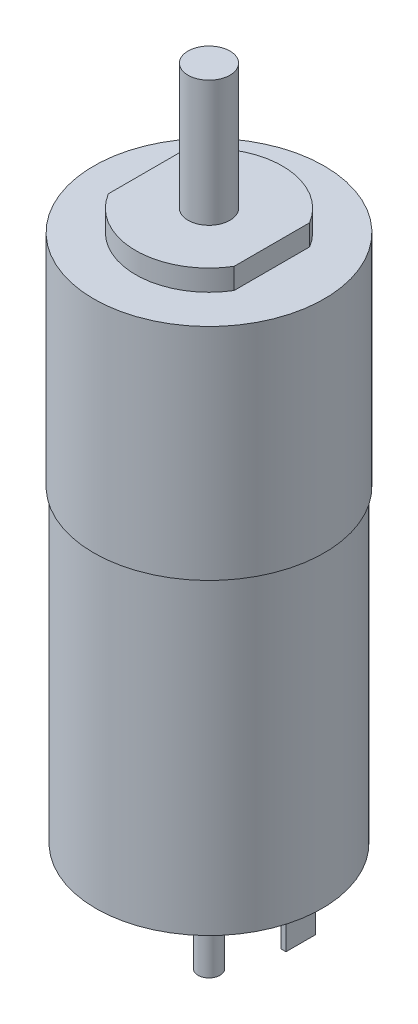
ISO-10303-21;
HEADER;
FILE_DESCRIPTION(('STEP AP214'),'2;1');
FILE_NAME('part.step','',(''),(''),'','','');
FILE_SCHEMA(('AUTOMOTIVE_DESIGN { 1 0 10303 214 1 1 1 1 }'));
ENDSEC;
DATA;
#1=APPLICATION_CONTEXT('core data for automotive mechanical design processes');
#2=APPLICATION_PROTOCOL_DEFINITION('international standard','automotive_design',2000,#1);
#3=PRODUCT_CONTEXT('',#1,'mechanical');
#4=PRODUCT('Part','Part','',(#3));
#5=PRODUCT_RELATED_PRODUCT_CATEGORY('part','',(#4));
#6=PRODUCT_DEFINITION_FORMATION('','',#4);
#7=PRODUCT_DEFINITION_CONTEXT('part definition',#1,'design');
#8=PRODUCT_DEFINITION('design','',#6,#7);
#9=PRODUCT_DEFINITION_SHAPE('','',#8);
#10=(LENGTH_UNIT() NAMED_UNIT(*) SI_UNIT(.MILLI.,.METRE.));
#11=(NAMED_UNIT(*) PLANE_ANGLE_UNIT() SI_UNIT($,.RADIAN.));
#12=(NAMED_UNIT(*) SI_UNIT($,.STERADIAN.) SOLID_ANGLE_UNIT());
#13=UNCERTAINTY_MEASURE_WITH_UNIT(LENGTH_MEASURE(1.E-05),#10,'distance_accuracy_value','');
#14=(GEOMETRIC_REPRESENTATION_CONTEXT(3) GLOBAL_UNCERTAINTY_ASSIGNED_CONTEXT((#13)) GLOBAL_UNIT_ASSIGNED_CONTEXT((#10,
#11,#12)) REPRESENTATION_CONTEXT('',''));
#15=CARTESIAN_POINT('',(0.,0.,0.));
#16=DIRECTION('',(0.,0.,1.));
#17=DIRECTION('',(1.,0.,0.));
#18=AXIS2_PLACEMENT_3D('',#15,#16,#17);
#19=CARTESIAN_POINT('',(0.,0.,0.));
#20=DIRECTION('',(0.,1.,0.));
#21=DIRECTION('',(0.,0.,1.));
#22=AXIS2_PLACEMENT_3D('',#19,#20,#21);
#23=PLANE('',#22);
#24=DIRECTION('',(0.,0.,-1.));
#25=VECTOR('',#24,1.);
#26=CARTESIAN_POINT('',(-8.75,0.,1.4));
#27=LINE('',#26,#25);
#28=CARTESIAN_POINT('',(-8.75,0.,1.4));
#29=VERTEX_POINT('',#28);
#30=CARTESIAN_POINT('',(-8.75,0.,-1.4));
#31=VERTEX_POINT('',#30);
#32=EDGE_CURVE('E148',#29,#31,#27,.T.);
#33=ORIENTED_EDGE('',*,*,#32,.F.);
#34=DIRECTION('',(-1.,0.,0.));
#35=VECTOR('',#34,1.);
#36=CARTESIAN_POINT('',(-8.75,0.,1.4));
#37=LINE('',#36,#35);
#38=CARTESIAN_POINT('',(-8.25,0.,1.4));
#39=VERTEX_POINT('',#38);
#40=EDGE_CURVE('E161',#39,#29,#37,.T.);
#41=ORIENTED_EDGE('',*,*,#40,.F.);
#42=DIRECTION('',(0.,0.,1.));
#43=VECTOR('',#42,1.);
#44=CARTESIAN_POINT('',(-8.25,0.,1.4));
#45=LINE('',#44,#43);
#46=CARTESIAN_POINT('',(-8.25,0.,-1.4));
#47=VERTEX_POINT('',#46);
#48=EDGE_CURVE('E170',#47,#39,#45,.T.);
#49=ORIENTED_EDGE('',*,*,#48,.F.);
#50=DIRECTION('',(1.,0.,0.));
#51=VECTOR('',#50,1.);
#52=CARTESIAN_POINT('',(-8.75,0.,-1.4));
#53=LINE('',#52,#51);
#54=EDGE_CURVE('E151',#31,#47,#53,.T.);
#55=ORIENTED_EDGE('',*,*,#54,.F.);
#56=EDGE_LOOP('',(#33,#41,#49,#55));
#57=FACE_BOUND('',#56,.T.);
#58=CARTESIAN_POINT('',(0.,0.,0.));
#59=DIRECTION('',(0.,-1.,0.));
#60=DIRECTION('',(0.,0.,-1.));
#61=AXIS2_PLACEMENT_3D('',#58,#59,#60);
#62=CIRCLE('',#61,3.75);
#63=CARTESIAN_POINT('',(0.,0.,-3.75));
#64=VERTEX_POINT('',#63);
#65=EDGE_CURVE('E45',#64,#64,#62,.T.);
#66=ORIENTED_EDGE('',*,*,#65,.F.);
#67=EDGE_LOOP('',(#66));
#68=FACE_BOUND('',#67,.T.);
#69=CARTESIAN_POINT('',(0.,0.,0.));
#70=DIRECTION('',(0.,1.,0.));
#71=DIRECTION('',(0.,0.,1.));
#72=AXIS2_PLACEMENT_3D('',#69,#70,#71);
#73=CIRCLE('',#72,10.8);
#74=CARTESIAN_POINT('',(0.,0.,10.8));
#75=VERTEX_POINT('',#74);
#76=EDGE_CURVE('E40',#75,#75,#73,.T.);
#77=ORIENTED_EDGE('',*,*,#76,.F.);
#78=EDGE_LOOP('',(#77));
#79=FACE_BOUND('',#78,.T.);
#80=DIRECTION('',(0.,0.,-1.));
#81=VECTOR('',#80,1.);
#82=CARTESIAN_POINT('',(8.25,0.,1.4));
#83=LINE('',#82,#81);
#84=CARTESIAN_POINT('',(8.25,0.,1.4));
#85=VERTEX_POINT('',#84);
#86=CARTESIAN_POINT('',(8.25,0.,-1.4));
#87=VERTEX_POINT('',#86);
#88=EDGE_CURVE('E147',#85,#87,#83,.T.);
#89=ORIENTED_EDGE('',*,*,#88,.F.);
#90=DIRECTION('',(-1.,0.,0.));
#91=VECTOR('',#90,1.);
#92=CARTESIAN_POINT('',(8.25,0.,1.4));
#93=LINE('',#92,#91);
#94=CARTESIAN_POINT('',(8.75,0.,1.4));
#95=VERTEX_POINT('',#94);
#96=EDGE_CURVE('E144',#95,#85,#93,.T.);
#97=ORIENTED_EDGE('',*,*,#96,.F.);
#98=DIRECTION('',(0.,0.,1.));
#99=VECTOR('',#98,1.);
#100=CARTESIAN_POINT('',(8.75,0.,1.4));
#101=LINE('',#100,#99);
#102=CARTESIAN_POINT('',(8.75,0.,-1.4));
#103=VERTEX_POINT('',#102);
#104=EDGE_CURVE('E58',#103,#95,#101,.T.);
#105=ORIENTED_EDGE('',*,*,#104,.F.);
#106=DIRECTION('',(1.,0.,0.));
#107=VECTOR('',#106,1.);
#108=CARTESIAN_POINT('',(8.25,0.,-1.4));
#109=LINE('',#108,#107);
#110=EDGE_CURVE('E53',#87,#103,#109,.T.);
#111=ORIENTED_EDGE('',*,*,#110,.F.);
#112=EDGE_LOOP('',(#89,#97,#105,#111));
#113=FACE_BOUND('',#112,.T.);
#114=ADVANCED_FACE('F36',(#57,#68,#79,#113),#23,.F.);
#115=CARTESIAN_POINT('',(0.,29.5,0.));
#116=DIRECTION('',(0.,-1.,0.));
#117=DIRECTION('',(0.,0.,-1.));
#118=AXIS2_PLACEMENT_3D('',#115,#116,#117);
#119=CYLINDRICAL_SURFACE('',#118,10.8);
#120=CARTESIAN_POINT('',(0.,29.5,0.));
#121=DIRECTION('',(0.,1.,0.));
#122=DIRECTION('',(0.,0.,1.));
#123=AXIS2_PLACEMENT_3D('',#120,#121,#122);
#124=CIRCLE('',#123,10.8);
#125=CARTESIAN_POINT('',(0.,29.5,10.8));
#126=VERTEX_POINT('',#125);
#127=EDGE_CURVE('E198',#126,#126,#124,.T.);
#128=ORIENTED_EDGE('',*,*,#127,.F.);
#129=EDGE_LOOP('',(#128));
#130=FACE_BOUND('',#129,.T.);
#131=ORIENTED_EDGE('',*,*,#76,.T.);
#132=EDGE_LOOP('',(#131));
#133=FACE_BOUND('',#132,.T.);
#134=ADVANCED_FACE('F38',(#130,#133),#119,.T.);
#135=CARTESIAN_POINT('',(0.,50.5,0.));
#136=DIRECTION('',(0.,-1.,0.));
#137=DIRECTION('',(0.,0.,-1.));
#138=AXIS2_PLACEMENT_3D('',#135,#136,#137);
#139=CYLINDRICAL_SURFACE('',#138,11.);
#140=CARTESIAN_POINT('',(0.,50.5,0.));
#141=DIRECTION('',(0.,1.,0.));
#142=DIRECTION('',(0.,0.,1.));
#143=AXIS2_PLACEMENT_3D('',#140,#141,#142);
#144=CIRCLE('',#143,11.);
#145=CARTESIAN_POINT('',(0.,50.5,-11.));
#146=VERTEX_POINT('',#145);
#147=EDGE_CURVE('E232',#146,#146,#144,.T.);
#148=CARTESIAN_POINT('',(0.,29.5,0.));
#149=DIRECTION('',(0.,1.,0.));
#150=DIRECTION('',(0.,0.,1.));
#151=AXIS2_PLACEMENT_3D('',#148,#149,#150);
#152=CIRCLE('',#151,11.);
#153=CARTESIAN_POINT('',(0.,29.5,-11.));
#154=VERTEX_POINT('',#153);
#155=EDGE_CURVE('E231',#154,#154,#152,.T.);
#156=CARTESIAN_POINT('',(0.,50.5,-11.));
#157=CARTESIAN_POINT('',(0.,50.28125,-11.));
#158=CARTESIAN_POINT('',(0.,50.0625,-11.));
#159=CARTESIAN_POINT('',(0.,49.625,-11.));
#160=CARTESIAN_POINT('',(0.,49.40625,-11.));
#161=CARTESIAN_POINT('',(0.,48.96875,-11.));
#162=CARTESIAN_POINT('',(0.,48.75,-11.));
#163=CARTESIAN_POINT('',(0.,48.3125,-11.));
#164=CARTESIAN_POINT('',(0.,48.09375,-11.));
#165=CARTESIAN_POINT('',(0.,47.65625,-11.));
#166=CARTESIAN_POINT('',(0.,47.4375,-11.));
#167=CARTESIAN_POINT('',(0.,47.,-11.));
#168=CARTESIAN_POINT('',(0.,46.78125,-11.));
#169=CARTESIAN_POINT('',(0.,46.34375,-11.));
#170=CARTESIAN_POINT('',(0.,46.125,-11.));
#171=CARTESIAN_POINT('',(0.,45.6875,-11.));
#172=CARTESIAN_POINT('',(0.,45.46875,-11.));
#173=CARTESIAN_POINT('',(0.,45.03125,-11.));
#174=CARTESIAN_POINT('',(0.,44.8125,-11.));
#175=CARTESIAN_POINT('',(0.,44.375,-11.));
#176=CARTESIAN_POINT('',(0.,44.15625,-11.));
#177=CARTESIAN_POINT('',(0.,43.71875,-11.));
#178=CARTESIAN_POINT('',(0.,43.5,-11.));
#179=CARTESIAN_POINT('',(0.,43.0625,-11.));
#180=CARTESIAN_POINT('',(0.,42.84375,-11.));
#181=CARTESIAN_POINT('',(0.,42.40625,-11.));
#182=CARTESIAN_POINT('',(0.,42.1875,-11.));
#183=CARTESIAN_POINT('',(0.,41.75,-11.));
#184=CARTESIAN_POINT('',(0.,41.53125,-11.));
#185=CARTESIAN_POINT('',(0.,41.09375,-11.));
#186=CARTESIAN_POINT('',(0.,40.875,-11.));
#187=CARTESIAN_POINT('',(0.,40.4375,-11.));
#188=CARTESIAN_POINT('',(0.,40.21875,-11.));
#189=CARTESIAN_POINT('',(0.,39.78125,-11.));
#190=CARTESIAN_POINT('',(0.,39.5625,-11.));
#191=CARTESIAN_POINT('',(0.,39.125,-11.));
#192=CARTESIAN_POINT('',(0.,38.90625,-11.));
#193=CARTESIAN_POINT('',(0.,38.46875,-11.));
#194=CARTESIAN_POINT('',(0.,38.25,-11.));
#195=CARTESIAN_POINT('',(0.,37.8125,-11.));
#196=CARTESIAN_POINT('',(0.,37.59375,-11.));
#197=CARTESIAN_POINT('',(0.,37.15625,-11.));
#198=CARTESIAN_POINT('',(0.,36.9375,-11.));
#199=CARTESIAN_POINT('',(0.,36.5,-11.));
#200=CARTESIAN_POINT('',(0.,36.28125,-11.));
#201=CARTESIAN_POINT('',(0.,35.84375,-11.));
#202=CARTESIAN_POINT('',(0.,35.625,-11.));
#203=CARTESIAN_POINT('',(0.,35.1875,-11.));
#204=CARTESIAN_POINT('',(0.,34.96875,-11.));
#205=CARTESIAN_POINT('',(0.,34.53125,-11.));
#206=CARTESIAN_POINT('',(0.,34.3125,-11.));
#207=CARTESIAN_POINT('',(0.,33.875,-11.));
#208=CARTESIAN_POINT('',(0.,33.65625,-11.));
#209=CARTESIAN_POINT('',(0.,33.21875,-11.));
#210=CARTESIAN_POINT('',(0.,33.,-11.));
#211=CARTESIAN_POINT('',(0.,32.5625,-11.));
#212=CARTESIAN_POINT('',(0.,32.34375,-11.));
#213=CARTESIAN_POINT('',(0.,31.90625,-11.));
#214=CARTESIAN_POINT('',(0.,31.6875,-11.));
#215=CARTESIAN_POINT('',(0.,31.25,-11.));
#216=CARTESIAN_POINT('',(0.,31.03125,-11.));
#217=CARTESIAN_POINT('',(0.,30.59375,-11.));
#218=CARTESIAN_POINT('',(0.,30.375,-11.));
#219=CARTESIAN_POINT('',(0.,29.9375,-11.));
#220=CARTESIAN_POINT('',(0.,29.71875,-11.));
#221=CARTESIAN_POINT('',(0.,29.5,-11.));
#222=B_SPLINE_CURVE_WITH_KNOTS('',3,(#156,#157,#158,#159,#160,#161,#162,#163,#164,#165,#166,
#167,#168,#169,#170,#171,#172,#173,#174,#175,#176,#177,#178,#179,#180,#181,#182,#183,#184,#185,
#186,#187,#188,#189,#190,#191,#192,#193,#194,#195,#196,#197,#198,#199,#200,#201,#202,#203,#204,
#205,#206,#207,#208,#209,#210,#211,#212,#213,#214,#215,#216,#217,#218,#219,#220,#221),
.UNSPECIFIED.,.F.,.F.,(4,2,2,2,2,2,2,2,2,2,2,2,2,2,2,2,2,2,2,2,2,2,2,2,2,2,2,2,2,2,2,2,4),(0.,
0.656249999999997,1.31249999999999,1.96875,2.625,3.28125,3.9375,4.59375,5.25,5.90624999999999,
6.5625,7.21875,7.875,8.53125,9.18749999999999,9.84375,10.5,11.15625,11.8125,12.46875,13.125,
13.78125,14.4375,15.09375,15.75,16.40625,17.0625,17.71875,18.375,19.03125,19.6875,20.34375,21.),.UNSPECIFIED.);
#223=EDGE_CURVE('BSEAM320',#146,#154,#222,.T.);
#224=ORIENTED_EDGE('',*,*,#147,.F.);
#225=ORIENTED_EDGE('',*,*,#155,.T.);
#226=ORIENTED_EDGE('',*,*,#223,.T.);
#227=ORIENTED_EDGE('',*,*,#223,.F.);
#228=EDGE_LOOP('',(#224,#226,#225,#227));
#229=FACE_BOUND('',#228,.T.);
#230=ADVANCED_FACE('F320',(#229),#139,.T.);
#231=CARTESIAN_POINT('',(0.,50.5,0.));
#232=DIRECTION('',(0.,1.,0.));
#233=DIRECTION('',(0.,0.,1.));
#234=AXIS2_PLACEMENT_3D('',#231,#232,#233);
#235=PLANE('',#234);
#236=CARTESIAN_POINT('',(0.,50.5,0.));
#237=DIRECTION('',(0.,1.,0.));
#238=DIRECTION('',(0.,0.,1.));
#239=AXIS2_PLACEMENT_3D('',#236,#237,#238);
#240=CIRCLE('',#239,7.);
#241=CARTESIAN_POINT('',(6.,50.5,-3.60555127546399));
#242=VERTEX_POINT('',#241);
#243=CARTESIAN_POINT('',(-6.,50.5,-3.60555127546399));
#244=VERTEX_POINT('',#243);
#245=EDGE_CURVE('E195',#242,#244,#240,.T.);
#246=ORIENTED_EDGE('',*,*,#245,.F.);
#247=DIRECTION('',(0.,0.,-1.));
#248=VECTOR('',#247,1.);
#249=CARTESIAN_POINT('',(6.,50.5,-3.60555127546399));
#250=LINE('',#249,#248);
#251=CARTESIAN_POINT('',(6.,50.5,3.60555127546399));
#252=VERTEX_POINT('',#251);
#253=EDGE_CURVE('E203',#252,#242,#250,.T.);
#254=ORIENTED_EDGE('',*,*,#253,.F.);
#255=CARTESIAN_POINT('',(0.,50.5,0.));
#256=DIRECTION('',(0.,1.,0.));
#257=DIRECTION('',(0.,0.,1.));
#258=AXIS2_PLACEMENT_3D('',#255,#256,#257);
#259=CIRCLE('',#258,7.);
#260=CARTESIAN_POINT('',(-6.,50.5,3.60555127546399));
#261=VERTEX_POINT('',#260);
#262=EDGE_CURVE('E215',#261,#252,#259,.T.);
#263=ORIENTED_EDGE('',*,*,#262,.F.);
#264=DIRECTION('',(0.,0.,1.));
#265=VECTOR('',#264,1.);
#266=CARTESIAN_POINT('',(-6.,50.5,-3.60555127546399));
#267=LINE('',#266,#265);
#268=EDGE_CURVE('E212',#244,#261,#267,.T.);
#269=ORIENTED_EDGE('',*,*,#268,.F.);
#270=EDGE_LOOP('',(#246,#254,#263,#269));
#271=FACE_BOUND('',#270,.T.);
#272=ORIENTED_EDGE('',*,*,#147,.T.);
#273=EDGE_LOOP('',(#272));
#274=FACE_BOUND('',#273,.T.);
#275=ADVANCED_FACE('F317',(#271,#274),#235,.T.);
#276=CARTESIAN_POINT('',(0.,29.5,0.));
#277=DIRECTION('',(0.,1.,0.));
#278=DIRECTION('',(0.,0.,1.));
#279=AXIS2_PLACEMENT_3D('',#276,#277,#278);
#280=PLANE('',#279);
#281=ORIENTED_EDGE('',*,*,#127,.T.);
#282=EDGE_LOOP('',(#281));
#283=FACE_BOUND('',#282,.T.);
#284=ORIENTED_EDGE('',*,*,#155,.F.);
#285=EDGE_LOOP('',(#284));
#286=FACE_BOUND('',#285,.T.);
#287=ADVANCED_FACE('F315',(#283,#286),#280,.F.);
#288=CARTESIAN_POINT('',(0.,52.5,0.));
#289=DIRECTION('',(0.,-1.,0.));
#290=DIRECTION('',(0.,0.,-1.));
#291=AXIS2_PLACEMENT_3D('',#288,#289,#290);
#292=CYLINDRICAL_SURFACE('',#291,7.);
#293=ORIENTED_EDGE('',*,*,#245,.T.);
#294=DIRECTION('',(0.,-1.,0.));
#295=VECTOR('',#294,1.);
#296=CARTESIAN_POINT('',(-6.,52.5,-3.60555127546399));
#297=LINE('',#296,#295);
#298=CARTESIAN_POINT('',(-6.,52.5,-3.60555127546399));
#299=VERTEX_POINT('',#298);
#300=EDGE_CURVE('E228',#299,#244,#297,.T.);
#301=ORIENTED_EDGE('',*,*,#300,.F.);
#302=CARTESIAN_POINT('',(0.,52.5,0.));
#303=DIRECTION('',(0.,1.,0.));
#304=DIRECTION('',(0.,0.,1.));
#305=AXIS2_PLACEMENT_3D('',#302,#303,#304);
#306=CIRCLE('',#305,7.);
#307=CARTESIAN_POINT('',(6.,52.5,-3.60555127546399));
#308=VERTEX_POINT('',#307);
#309=EDGE_CURVE('E199',#308,#299,#306,.T.);
#310=ORIENTED_EDGE('',*,*,#309,.F.);
#311=DIRECTION('',(0.,-1.,0.));
#312=VECTOR('',#311,1.);
#313=CARTESIAN_POINT('',(6.,52.5,-3.60555127546399));
#314=LINE('',#313,#312);
#315=EDGE_CURVE('E209',#308,#242,#314,.T.);
#316=ORIENTED_EDGE('',*,*,#315,.T.);
#317=EDGE_LOOP('',(#293,#301,#310,#316));
#318=FACE_BOUND('',#317,.T.);
#319=ADVANCED_FACE('F311',(#318),#292,.T.);
#320=CARTESIAN_POINT('',(-6.,52.5,-3.60555127546399));
#321=DIRECTION('',(1.,0.,0.));
#322=DIRECTION('',(0.,0.,-1.));
#323=AXIS2_PLACEMENT_3D('',#320,#321,#322);
#324=PLANE('',#323);
#325=ORIENTED_EDGE('',*,*,#268,.T.);
#326=DIRECTION('',(0.,-1.,0.));
#327=VECTOR('',#326,1.);
#328=CARTESIAN_POINT('',(-6.,52.5,3.60555127546399));
#329=LINE('',#328,#327);
#330=CARTESIAN_POINT('',(-6.,52.5,3.60555127546399));
#331=VERTEX_POINT('',#330);
#332=EDGE_CURVE('E225',#331,#261,#329,.T.);
#333=ORIENTED_EDGE('',*,*,#332,.F.);
#334=DIRECTION('',(0.,0.,1.));
#335=VECTOR('',#334,1.);
#336=CARTESIAN_POINT('',(-6.,52.5,-3.60555127546399));
#337=LINE('',#336,#335);
#338=EDGE_CURVE('E202',#299,#331,#337,.T.);
#339=ORIENTED_EDGE('',*,*,#338,.F.);
#340=ORIENTED_EDGE('',*,*,#300,.T.);
#341=EDGE_LOOP('',(#325,#333,#339,#340));
#342=FACE_BOUND('',#341,.T.);
#343=ADVANCED_FACE('F307',(#342),#324,.F.);
#344=CARTESIAN_POINT('',(0.,52.5,0.));
#345=DIRECTION('',(0.,-1.,0.));
#346=DIRECTION('',(0.,0.,-1.));
#347=AXIS2_PLACEMENT_3D('',#344,#345,#346);
#348=CYLINDRICAL_SURFACE('',#347,7.);
#349=ORIENTED_EDGE('',*,*,#262,.T.);
#350=DIRECTION('',(0.,-1.,0.));
#351=VECTOR('',#350,1.);
#352=CARTESIAN_POINT('',(6.,52.5,3.60555127546399));
#353=LINE('',#352,#351);
#354=CARTESIAN_POINT('',(6.,52.5,3.60555127546399));
#355=VERTEX_POINT('',#354);
#356=EDGE_CURVE('E222',#355,#252,#353,.T.);
#357=ORIENTED_EDGE('',*,*,#356,.F.);
#358=CARTESIAN_POINT('',(0.,52.5,0.));
#359=DIRECTION('',(0.,1.,0.));
#360=DIRECTION('',(0.,0.,1.));
#361=AXIS2_PLACEMENT_3D('',#358,#359,#360);
#362=CIRCLE('',#361,7.);
#363=EDGE_CURVE('E205',#331,#355,#362,.T.);
#364=ORIENTED_EDGE('',*,*,#363,.F.);
#365=ORIENTED_EDGE('',*,*,#332,.T.);
#366=EDGE_LOOP('',(#349,#357,#364,#365));
#367=FACE_BOUND('',#366,.T.);
#368=ADVANCED_FACE('F303',(#367),#348,.T.);
#369=CARTESIAN_POINT('',(6.,52.5,-3.60555127546399));
#370=DIRECTION('',(-1.,0.,0.));
#371=DIRECTION('',(0.,0.,1.));
#372=AXIS2_PLACEMENT_3D('',#369,#370,#371);
#373=PLANE('',#372);
#374=ORIENTED_EDGE('',*,*,#253,.T.);
#375=ORIENTED_EDGE('',*,*,#315,.F.);
#376=DIRECTION('',(0.,0.,-1.));
#377=VECTOR('',#376,1.);
#378=CARTESIAN_POINT('',(6.,52.5,-3.60555127546399));
#379=LINE('',#378,#377);
#380=EDGE_CURVE('E207',#355,#308,#379,.T.);
#381=ORIENTED_EDGE('',*,*,#380,.F.);
#382=ORIENTED_EDGE('',*,*,#356,.T.);
#383=EDGE_LOOP('',(#374,#375,#381,#382));
#384=FACE_BOUND('',#383,.T.);
#385=ADVANCED_FACE('F299',(#384),#373,.F.);
#386=CARTESIAN_POINT('',(0.,52.5,0.));
#387=DIRECTION('',(0.,1.,0.));
#388=DIRECTION('',(0.,0.,1.));
#389=AXIS2_PLACEMENT_3D('',#386,#387,#388);
#390=PLANE('',#389);
#391=CARTESIAN_POINT('',(0.,52.5,0.));
#392=DIRECTION('',(0.,1.,0.));
#393=DIRECTION('',(0.,0.,1.));
#394=AXIS2_PLACEMENT_3D('',#391,#392,#393);
#395=CIRCLE('',#394,2.);
#396=CARTESIAN_POINT('',(0.,52.5,2.));
#397=VERTEX_POINT('',#396);
#398=EDGE_CURVE('E192',#397,#397,#395,.T.);
#399=ORIENTED_EDGE('',*,*,#398,.F.);
#400=EDGE_LOOP('',(#399));
#401=FACE_BOUND('',#400,.T.);
#402=ORIENTED_EDGE('',*,*,#309,.T.);
#403=ORIENTED_EDGE('',*,*,#338,.T.);
#404=ORIENTED_EDGE('',*,*,#363,.T.);
#405=ORIENTED_EDGE('',*,*,#380,.T.);
#406=EDGE_LOOP('',(#402,#403,#404,#405));
#407=FACE_BOUND('',#406,.T.);
#408=ADVANCED_FACE('F295',(#401,#407),#390,.T.);
#409=CARTESIAN_POINT('',(0.,64.5,0.));
#410=DIRECTION('',(0.,-1.,0.));
#411=DIRECTION('',(0.,0.,-1.));
#412=AXIS2_PLACEMENT_3D('',#409,#410,#411);
#413=CYLINDRICAL_SURFACE('',#412,2.);
#414=CARTESIAN_POINT('',(0.,64.5,0.));
#415=DIRECTION('',(0.,1.,0.));
#416=DIRECTION('',(0.,0.,1.));
#417=AXIS2_PLACEMENT_3D('',#414,#415,#416);
#418=CIRCLE('',#417,2.);
#419=CARTESIAN_POINT('',(0.,64.5,2.));
#420=VERTEX_POINT('',#419);
#421=EDGE_CURVE('E189',#420,#420,#418,.T.);
#422=ORIENTED_EDGE('',*,*,#421,.F.);
#423=EDGE_LOOP('',(#422));
#424=FACE_BOUND('',#423,.T.);
#425=ORIENTED_EDGE('',*,*,#398,.T.);
#426=EDGE_LOOP('',(#425));
#427=FACE_BOUND('',#426,.T.);
#428=ADVANCED_FACE('F288',(#424,#427),#413,.T.);
#429=CARTESIAN_POINT('',(0.,64.5,0.));
#430=DIRECTION('',(0.,1.,0.));
#431=DIRECTION('',(0.,0.,1.));
#432=AXIS2_PLACEMENT_3D('',#429,#430,#431);
#433=PLANE('',#432);
#434=ORIENTED_EDGE('',*,*,#421,.T.);
#435=EDGE_LOOP('',(#434));
#436=FACE_BOUND('',#435,.T.);
#437=ADVANCED_FACE('F281',(#436),#433,.T.);
#438=CARTESIAN_POINT('',(0.,-2.,0.));
#439=DIRECTION('',(0.,1.,0.));
#440=DIRECTION('',(0.,0.,1.));
#441=AXIS2_PLACEMENT_3D('',#438,#439,#440);
#442=CYLINDRICAL_SURFACE('',#441,3.75);
#443=CARTESIAN_POINT('',(0.,-2.,0.));
#444=DIRECTION('',(0.,-1.,0.));
#445=DIRECTION('',(0.,0.,-1.));
#446=AXIS2_PLACEMENT_3D('',#443,#444,#445);
#447=CIRCLE('',#446,3.75);
#448=CARTESIAN_POINT('',(0.,-2.,-3.75));
#449=VERTEX_POINT('',#448);
#450=EDGE_CURVE('E186',#449,#449,#447,.T.);
#451=ORIENTED_EDGE('',*,*,#450,.F.);
#452=EDGE_LOOP('',(#451));
#453=FACE_BOUND('',#452,.T.);
#454=ORIENTED_EDGE('',*,*,#65,.T.);
#455=EDGE_LOOP('',(#454));
#456=FACE_BOUND('',#455,.T.);
#457=ADVANCED_FACE('F275',(#453,#456),#442,.T.);
#458=CARTESIAN_POINT('',(0.,-2.,0.));
#459=DIRECTION('',(0.,-1.,0.));
#460=DIRECTION('',(0.,0.,-1.));
#461=AXIS2_PLACEMENT_3D('',#458,#459,#460);
#462=PLANE('',#461);
#463=CARTESIAN_POINT('',(0.,-2.,0.));
#464=DIRECTION('',(0.,-1.,0.));
#465=DIRECTION('',(0.,0.,-1.));
#466=AXIS2_PLACEMENT_3D('',#463,#464,#465);
#467=CIRCLE('',#466,1.05);
#468=CARTESIAN_POINT('',(0.,-2.,-1.05));
#469=VERTEX_POINT('',#468);
#470=EDGE_CURVE('E11',#469,#469,#467,.T.);
#471=ORIENTED_EDGE('',*,*,#470,.F.);
#472=EDGE_LOOP('',(#471));
#473=FACE_BOUND('',#472,.T.);
#474=ORIENTED_EDGE('',*,*,#450,.T.);
#475=EDGE_LOOP('',(#474));
#476=FACE_BOUND('',#475,.T.);
#477=ADVANCED_FACE('F271',(#473,#476),#462,.T.);
#478=CARTESIAN_POINT('',(-8.75,-3.9,1.4));
#479=DIRECTION('',(1.,0.,0.));
#480=DIRECTION('',(0.,0.,-1.));
#481=AXIS2_PLACEMENT_3D('',#478,#479,#480);
#482=PLANE('',#481);
#483=ORIENTED_EDGE('',*,*,#32,.T.);
#484=DIRECTION('',(0.,1.,0.));
#485=VECTOR('',#484,1.);
#486=CARTESIAN_POINT('',(-8.75,-3.9,-1.4));
#487=LINE('',#486,#485);
#488=CARTESIAN_POINT('',(-8.75,-3.9,-1.4));
#489=VERTEX_POINT('',#488);
#490=EDGE_CURVE('E183',#489,#31,#487,.T.);
#491=ORIENTED_EDGE('',*,*,#490,.F.);
#492=DIRECTION('',(0.,0.,-1.));
#493=VECTOR('',#492,1.);
#494=CARTESIAN_POINT('',(-8.75,-3.9,1.4));
#495=LINE('',#494,#493);
#496=CARTESIAN_POINT('',(-8.75,-3.9,1.4));
#497=VERTEX_POINT('',#496);
#498=EDGE_CURVE('E157',#497,#489,#495,.T.);
#499=ORIENTED_EDGE('',*,*,#498,.F.);
#500=DIRECTION('',(0.,1.,0.));
#501=VECTOR('',#500,1.);
#502=CARTESIAN_POINT('',(-8.75,-3.9,1.4));
#503=LINE('',#502,#501);
#504=EDGE_CURVE('E166',#497,#29,#503,.T.);
#505=ORIENTED_EDGE('',*,*,#504,.T.);
#506=EDGE_LOOP('',(#483,#491,#499,#505));
#507=FACE_BOUND('',#506,.T.);
#508=ADVANCED_FACE('F274',(#507),#482,.F.);
#509=CARTESIAN_POINT('',(-8.75,-3.9,-1.4));
#510=DIRECTION('',(0.,0.,1.));
#511=DIRECTION('',(1.,0.,0.));
#512=AXIS2_PLACEMENT_3D('',#509,#510,#511);
#513=PLANE('',#512);
#514=ORIENTED_EDGE('',*,*,#54,.T.);
#515=DIRECTION('',(0.,1.,0.));
#516=VECTOR('',#515,1.);
#517=CARTESIAN_POINT('',(-8.25,-3.9,-1.4));
#518=LINE('',#517,#516);
#519=CARTESIAN_POINT('',(-8.25,-3.9,-1.4));
#520=VERTEX_POINT('',#519);
#521=EDGE_CURVE('E180',#520,#47,#518,.T.);
#522=ORIENTED_EDGE('',*,*,#521,.F.);
#523=DIRECTION('',(1.,0.,0.));
#524=VECTOR('',#523,1.);
#525=CARTESIAN_POINT('',(-8.75,-3.9,-1.4));
#526=LINE('',#525,#524);
#527=EDGE_CURVE('E160',#489,#520,#526,.T.);
#528=ORIENTED_EDGE('',*,*,#527,.F.);
#529=ORIENTED_EDGE('',*,*,#490,.T.);
#530=EDGE_LOOP('',(#514,#522,#528,#529));
#531=FACE_BOUND('',#530,.T.);
#532=ADVANCED_FACE('F354',(#531),#513,.F.);
#533=CARTESIAN_POINT('',(-8.25,-3.9,1.4));
#534=DIRECTION('',(-1.,0.,0.));
#535=DIRECTION('',(0.,0.,1.));
#536=AXIS2_PLACEMENT_3D('',#533,#534,#535);
#537=PLANE('',#536);
#538=ORIENTED_EDGE('',*,*,#48,.T.);
#539=DIRECTION('',(0.,1.,0.));
#540=VECTOR('',#539,1.);
#541=CARTESIAN_POINT('',(-8.25,-3.9,1.4));
#542=LINE('',#541,#540);
#543=CARTESIAN_POINT('',(-8.25,-3.9,1.4));
#544=VERTEX_POINT('',#543);
#545=EDGE_CURVE('E177',#544,#39,#542,.T.);
#546=ORIENTED_EDGE('',*,*,#545,.F.);
#547=DIRECTION('',(0.,0.,1.));
#548=VECTOR('',#547,1.);
#549=CARTESIAN_POINT('',(-8.25,-3.9,1.4));
#550=LINE('',#549,#548);
#551=EDGE_CURVE('E163',#520,#544,#550,.T.);
#552=ORIENTED_EDGE('',*,*,#551,.F.);
#553=ORIENTED_EDGE('',*,*,#521,.T.);
#554=EDGE_LOOP('',(#538,#546,#552,#553));
#555=FACE_BOUND('',#554,.T.);
#556=ADVANCED_FACE('F363',(#555),#537,.F.);
#557=CARTESIAN_POINT('',(-8.75,-3.9,1.4));
#558=DIRECTION('',(0.,0.,-1.));
#559=DIRECTION('',(-1.,0.,0.));
#560=AXIS2_PLACEMENT_3D('',#557,#558,#559);
#561=PLANE('',#560);
#562=ORIENTED_EDGE('',*,*,#40,.T.);
#563=ORIENTED_EDGE('',*,*,#504,.F.);
#564=DIRECTION('',(-1.,0.,0.));
#565=VECTOR('',#564,1.);
#566=CARTESIAN_POINT('',(-8.75,-3.9,1.4));
#567=LINE('',#566,#565);
#568=EDGE_CURVE('E165',#544,#497,#567,.T.);
#569=ORIENTED_EDGE('',*,*,#568,.F.);
#570=ORIENTED_EDGE('',*,*,#545,.T.);
#571=EDGE_LOOP('',(#562,#563,#569,#570));
#572=FACE_BOUND('',#571,.T.);
#573=ADVANCED_FACE('F373',(#572),#561,.F.);
#574=CARTESIAN_POINT('',(0.,-3.9,0.));
#575=DIRECTION('',(0.,-1.,0.));
#576=DIRECTION('',(0.,0.,-1.));
#577=AXIS2_PLACEMENT_3D('',#574,#575,#576);
#578=PLANE('',#577);
#579=ORIENTED_EDGE('',*,*,#498,.T.);
#580=ORIENTED_EDGE('',*,*,#527,.T.);
#581=ORIENTED_EDGE('',*,*,#551,.T.);
#582=ORIENTED_EDGE('',*,*,#568,.T.);
#583=EDGE_LOOP('',(#579,#580,#581,#582));
#584=FACE_BOUND('',#583,.T.);
#585=ADVANCED_FACE('F383',(#584),#578,.T.);
#586=CARTESIAN_POINT('',(8.25,-3.9,1.4));
#587=DIRECTION('',(1.,0.,0.));
#588=DIRECTION('',(0.,0.,-1.));
#589=AXIS2_PLACEMENT_3D('',#586,#587,#588);
#590=PLANE('',#589);
#591=ORIENTED_EDGE('',*,*,#88,.T.);
#592=DIRECTION('',(0.,1.,0.));
#593=VECTOR('',#592,1.);
#594=CARTESIAN_POINT('',(8.25,-3.9,-1.4));
#595=LINE('',#594,#593);
#596=CARTESIAN_POINT('',(8.25,-3.9,-1.4));
#597=VERTEX_POINT('',#596);
#598=EDGE_CURVE('E128',#597,#87,#595,.T.);
#599=ORIENTED_EDGE('',*,*,#598,.F.);
#600=DIRECTION('',(0.,0.,-1.));
#601=VECTOR('',#600,1.);
#602=CARTESIAN_POINT('',(8.25,-3.9,1.4));
#603=LINE('',#602,#601);
#604=CARTESIAN_POINT('',(8.25,-3.9,1.4));
#605=VERTEX_POINT('',#604);
#606=EDGE_CURVE('E135',#605,#597,#603,.T.);
#607=ORIENTED_EDGE('',*,*,#606,.F.);
#608=DIRECTION('',(0.,1.,0.));
#609=VECTOR('',#608,1.);
#610=CARTESIAN_POINT('',(8.25,-3.9,1.4));
#611=LINE('',#610,#609);
#612=EDGE_CURVE('E251',#605,#85,#611,.T.);
#613=ORIENTED_EDGE('',*,*,#612,.T.);
#614=EDGE_LOOP('',(#591,#599,#607,#613));
#615=FACE_BOUND('',#614,.T.);
#616=ADVANCED_FACE('F146',(#615),#590,.F.);
#617=CARTESIAN_POINT('',(8.25,-3.9,-1.4));
#618=DIRECTION('',(0.,0.,1.));
#619=DIRECTION('',(1.,0.,0.));
#620=AXIS2_PLACEMENT_3D('',#617,#618,#619);
#621=PLANE('',#620);
#622=ORIENTED_EDGE('',*,*,#110,.T.);
#623=DIRECTION('',(0.,1.,0.));
#624=VECTOR('',#623,1.);
#625=CARTESIAN_POINT('',(8.75,-3.9,-1.4));
#626=LINE('',#625,#624);
#627=CARTESIAN_POINT('',(8.75,-3.9,-1.4));
#628=VERTEX_POINT('',#627);
#629=EDGE_CURVE('E131',#628,#103,#626,.T.);
#630=ORIENTED_EDGE('',*,*,#629,.F.);
#631=DIRECTION('',(1.,0.,0.));
#632=VECTOR('',#631,1.);
#633=CARTESIAN_POINT('',(8.25,-3.9,-1.4));
#634=LINE('',#633,#632);
#635=EDGE_CURVE('E124',#597,#628,#634,.T.);
#636=ORIENTED_EDGE('',*,*,#635,.F.);
#637=ORIENTED_EDGE('',*,*,#598,.T.);
#638=EDGE_LOOP('',(#622,#630,#636,#637));
#639=FACE_BOUND('',#638,.T.);
#640=ADVANCED_FACE('F126',(#639),#621,.F.);
#641=CARTESIAN_POINT('',(8.75,-3.9,1.4));
#642=DIRECTION('',(-1.,0.,0.));
#643=DIRECTION('',(0.,0.,1.));
#644=AXIS2_PLACEMENT_3D('',#641,#642,#643);
#645=PLANE('',#644);
#646=ORIENTED_EDGE('',*,*,#104,.T.);
#647=DIRECTION('',(0.,1.,0.));
#648=VECTOR('',#647,1.);
#649=CARTESIAN_POINT('',(8.75,-3.9,1.4));
#650=LINE('',#649,#648);
#651=CARTESIAN_POINT('',(8.75,-3.9,1.4));
#652=VERTEX_POINT('',#651);
#653=EDGE_CURVE('E153',#652,#95,#650,.T.);
#654=ORIENTED_EDGE('',*,*,#653,.F.);
#655=DIRECTION('',(0.,0.,1.));
#656=VECTOR('',#655,1.);
#657=CARTESIAN_POINT('',(8.75,-3.9,1.4));
#658=LINE('',#657,#656);
#659=EDGE_CURVE('E134',#628,#652,#658,.T.);
#660=ORIENTED_EDGE('',*,*,#659,.F.);
#661=ORIENTED_EDGE('',*,*,#629,.T.);
#662=EDGE_LOOP('',(#646,#654,#660,#661));
#663=FACE_BOUND('',#662,.T.);
#664=ADVANCED_FACE('F410',(#663),#645,.F.);
#665=CARTESIAN_POINT('',(8.25,-3.9,1.4));
#666=DIRECTION('',(0.,0.,-1.));
#667=DIRECTION('',(-1.,0.,0.));
#668=AXIS2_PLACEMENT_3D('',#665,#666,#667);
#669=PLANE('',#668);
#670=ORIENTED_EDGE('',*,*,#96,.T.);
#671=ORIENTED_EDGE('',*,*,#612,.F.);
#672=DIRECTION('',(-1.,0.,0.));
#673=VECTOR('',#672,1.);
#674=CARTESIAN_POINT('',(8.25,-3.9,1.4));
#675=LINE('',#674,#673);
#676=EDGE_CURVE('E140',#652,#605,#675,.T.);
#677=ORIENTED_EDGE('',*,*,#676,.F.);
#678=ORIENTED_EDGE('',*,*,#653,.T.);
#679=EDGE_LOOP('',(#670,#671,#677,#678));
#680=FACE_BOUND('',#679,.T.);
#681=ADVANCED_FACE('F250',(#680),#669,.F.);
#682=CARTESIAN_POINT('',(0.,-3.9,0.));
#683=DIRECTION('',(0.,-1.,0.));
#684=DIRECTION('',(0.,0.,-1.));
#685=AXIS2_PLACEMENT_3D('',#682,#683,#684);
#686=PLANE('',#685);
#687=ORIENTED_EDGE('',*,*,#606,.T.);
#688=ORIENTED_EDGE('',*,*,#635,.T.);
#689=ORIENTED_EDGE('',*,*,#659,.T.);
#690=ORIENTED_EDGE('',*,*,#676,.T.);
#691=EDGE_LOOP('',(#687,#688,#689,#690));
#692=FACE_BOUND('',#691,.T.);
#693=ADVANCED_FACE('F138',(#692),#686,.T.);
#694=CARTESIAN_POINT('',(0.,-10.4,0.));
#695=DIRECTION('',(0.,1.,0.));
#696=DIRECTION('',(0.,0.,1.));
#697=AXIS2_PLACEMENT_3D('',#694,#695,#696);
#698=CYLINDRICAL_SURFACE('',#697,1.05);
#699=CARTESIAN_POINT('',(0.,-10.4,0.));
#700=DIRECTION('',(0.,-1.,0.));
#701=DIRECTION('',(0.,0.,-1.));
#702=AXIS2_PLACEMENT_3D('',#699,#700,#701);
#703=CIRCLE('',#702,1.05);
#704=CARTESIAN_POINT('',(0.,-10.4,-1.05));
#705=VERTEX_POINT('',#704);
#706=EDGE_CURVE('E246',#705,#705,#703,.T.);
#707=ORIENTED_EDGE('',*,*,#706,.F.);
#708=EDGE_LOOP('',(#707));
#709=FACE_BOUND('',#708,.T.);
#710=ORIENTED_EDGE('',*,*,#470,.T.);
#711=EDGE_LOOP('',(#710));
#712=FACE_BOUND('',#711,.T.);
#713=ADVANCED_FACE('F265',(#709,#712),#698,.T.);
#714=CARTESIAN_POINT('',(0.,-10.4,0.));
#715=DIRECTION('',(0.,-1.,0.));
#716=DIRECTION('',(0.,0.,-1.));
#717=AXIS2_PLACEMENT_3D('',#714,#715,#716);
#718=PLANE('',#717);
#719=ORIENTED_EDGE('',*,*,#706,.T.);
#720=EDGE_LOOP('',(#719));
#721=FACE_BOUND('',#720,.T.);
#722=ADVANCED_FACE('F263',(#721),#718,.T.);
#723=CLOSED_SHELL('',(#114,#134,#230,#275,#287,#319,#343,#368,#385,#408,#428,#437,#457,#477,
#508,#532,#556,#573,#585,#616,#640,#664,#681,#693,#713,#722));
#724=MANIFOLD_SOLID_BREP('B2',#723);
#725=ADVANCED_BREP_SHAPE_REPRESENTATION('',(#18,#724),#14);
#726=SHAPE_DEFINITION_REPRESENTATION(#9,#725);
ENDSEC;
END-ISO-10303-21;
